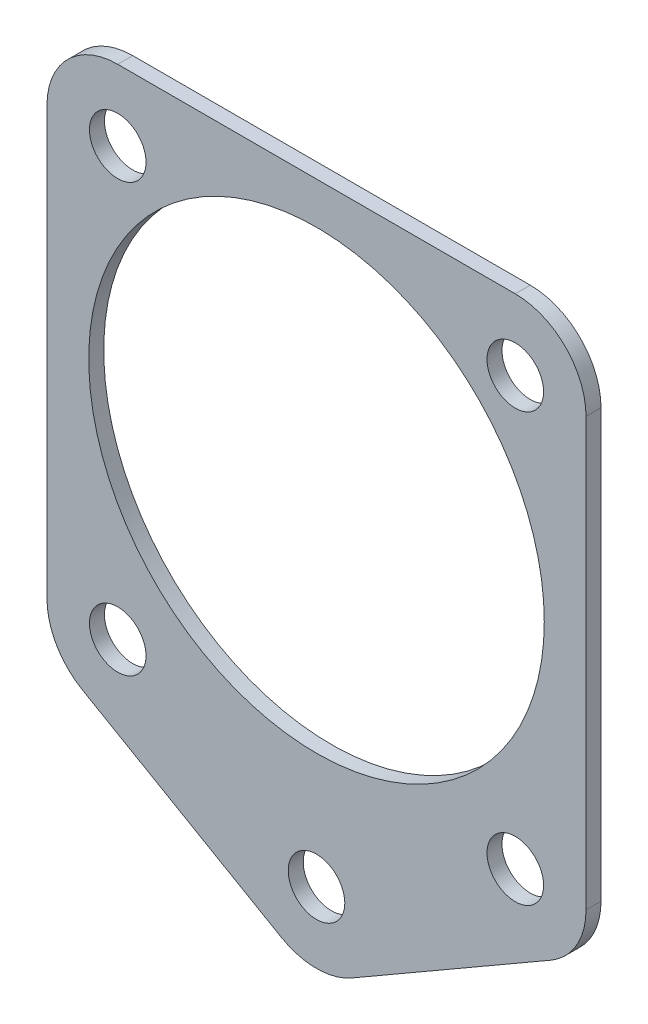
ISO-10303-21;
HEADER;
FILE_DESCRIPTION(('STEP AP214'),'2;1');
FILE_NAME('part.step','',(''),(''),'','','');
FILE_SCHEMA(('AUTOMOTIVE_DESIGN { 1 0 10303 214 1 1 1 1 }'));
ENDSEC;
DATA;
#1=APPLICATION_CONTEXT('core data for automotive mechanical design processes');
#2=APPLICATION_PROTOCOL_DEFINITION('international standard','automotive_design',2000,#1);
#3=PRODUCT_CONTEXT('',#1,'mechanical');
#4=PRODUCT('Part','Part','',(#3));
#5=PRODUCT_RELATED_PRODUCT_CATEGORY('part','',(#4));
#6=PRODUCT_DEFINITION_FORMATION('','',#4);
#7=PRODUCT_DEFINITION_CONTEXT('part definition',#1,'design');
#8=PRODUCT_DEFINITION('design','',#6,#7);
#9=PRODUCT_DEFINITION_SHAPE('','',#8);
#10=(LENGTH_UNIT() NAMED_UNIT(*) SI_UNIT(.MILLI.,.METRE.));
#11=(NAMED_UNIT(*) PLANE_ANGLE_UNIT() SI_UNIT($,.RADIAN.));
#12=(NAMED_UNIT(*) SI_UNIT($,.STERADIAN.) SOLID_ANGLE_UNIT());
#13=UNCERTAINTY_MEASURE_WITH_UNIT(LENGTH_MEASURE(1.E-05),#10,'distance_accuracy_value','');
#14=(GEOMETRIC_REPRESENTATION_CONTEXT(3) GLOBAL_UNCERTAINTY_ASSIGNED_CONTEXT((#13)) GLOBAL_UNIT_ASSIGNED_CONTEXT((#10,
#11,#12)) REPRESENTATION_CONTEXT('',''));
#15=CARTESIAN_POINT('',(0.,0.,0.));
#16=DIRECTION('',(0.,0.,1.));
#17=DIRECTION('',(1.,0.,0.));
#18=AXIS2_PLACEMENT_3D('',#15,#16,#17);
#19=CARTESIAN_POINT('',(6.35,3.66617420935412,1.3462));
#20=DIRECTION('',(0.,0.,1.));
#21=DIRECTION('',(1.,0.,0.));
#22=AXIS2_PLACEMENT_3D('',#19,#20,#21);
#23=PLANE('',#22);
#24=CARTESIAN_POINT('',(24.1935,-6.635775318931,1.3462));
#25=DIRECTION('',(0.,0.,1.));
#26=DIRECTION('',(1.,0.,0.));
#27=AXIS2_PLACEMENT_3D('',#24,#25,#26);
#28=CIRCLE('',#27,2.54);
#29=CARTESIAN_POINT('',(26.7335,-6.635775318931,1.3462));
#30=VERTEX_POINT('',#29);
#31=EDGE_CURVE('E229',#30,#30,#28,.T.);
#32=ORIENTED_EDGE('',*,*,#31,.F.);
#33=EDGE_LOOP('',(#32));
#34=FACE_BOUND('',#33,.T.);
#35=CARTESIAN_POINT('',(42.037,3.66617420935412,1.3462));
#36=DIRECTION('',(0.,0.,1.));
#37=DIRECTION('',(1.,0.,0.));
#38=AXIS2_PLACEMENT_3D('',#35,#36,#37);
#39=CIRCLE('',#38,2.54);
#40=CARTESIAN_POINT('',(44.577,3.66617420935412,1.3462));
#41=VERTEX_POINT('',#40);
#42=EDGE_CURVE('E217',#41,#41,#39,.T.);
#43=ORIENTED_EDGE('',*,*,#42,.F.);
#44=EDGE_LOOP('',(#43));
#45=FACE_BOUND('',#44,.T.);
#46=CARTESIAN_POINT('',(6.35,42.037,1.3462));
#47=DIRECTION('',(0.,0.,1.));
#48=DIRECTION('',(1.,0.,0.));
#49=AXIS2_PLACEMENT_3D('',#46,#47,#48);
#50=CIRCLE('',#49,2.54);
#51=CARTESIAN_POINT('',(8.89,42.037,1.3462));
#52=VERTEX_POINT('',#51);
#53=EDGE_CURVE('E145',#52,#52,#50,.T.);
#54=ORIENTED_EDGE('',*,*,#53,.F.);
#55=EDGE_LOOP('',(#54));
#56=FACE_BOUND('',#55,.T.);
#57=CARTESIAN_POINT('',(6.35,3.66617420935412,1.3462));
#58=DIRECTION('',(0.,0.,1.));
#59=DIRECTION('',(1.,0.,0.));
#60=AXIS2_PLACEMENT_3D('',#57,#58,#59);
#61=CIRCLE('',#60,6.35);
#62=CARTESIAN_POINT('',(0.,3.66617420935411,1.3462));
#63=VERTEX_POINT('',#62);
#64=CARTESIAN_POINT('',(3.175,-1.83308710467707,1.3462));
#65=VERTEX_POINT('',#64);
#66=EDGE_CURVE('E160',#63,#65,#61,.T.);
#67=ORIENTED_EDGE('',*,*,#66,.T.);
#68=DIRECTION('',(0.866025403784438,-0.500000000000001,0.));
#69=VECTOR('',#68,1.);
#70=CARTESIAN_POINT('',(3.175,-1.83308710467707,1.3462));
#71=LINE('',#70,#69);
#72=CARTESIAN_POINT('',(21.0185,-12.1350366329622,1.3462));
#73=VERTEX_POINT('',#72);
#74=EDGE_CURVE('E98',#65,#73,#71,.T.);
#75=ORIENTED_EDGE('',*,*,#74,.T.);
#76=CARTESIAN_POINT('',(24.1935,-6.635775318931,1.3462));
#77=DIRECTION('',(0.,0.,1.));
#78=DIRECTION('',(1.,0.,0.));
#79=AXIS2_PLACEMENT_3D('',#76,#77,#78);
#80=CIRCLE('',#79,6.35);
#81=CARTESIAN_POINT('',(27.3685,-12.1350366329622,1.3462));
#82=VERTEX_POINT('',#81);
#83=EDGE_CURVE('E181',#73,#82,#80,.T.);
#84=ORIENTED_EDGE('',*,*,#83,.T.);
#85=DIRECTION('',(0.866025403784438,0.500000000000001,0.));
#86=VECTOR('',#85,1.);
#87=CARTESIAN_POINT('',(27.3685,-12.1350366329622,1.3462));
#88=LINE('',#87,#86);
#89=CARTESIAN_POINT('',(45.212,-1.83308710467706,1.3462));
#90=VERTEX_POINT('',#89);
#91=EDGE_CURVE('E200',#82,#90,#88,.T.);
#92=ORIENTED_EDGE('',*,*,#91,.T.);
#93=CARTESIAN_POINT('',(42.037,3.66617420935412,1.3462));
#94=DIRECTION('',(0.,0.,1.));
#95=DIRECTION('',(1.,0.,0.));
#96=AXIS2_PLACEMENT_3D('',#93,#94,#95);
#97=CIRCLE('',#96,6.35);
#98=CARTESIAN_POINT('',(48.387,3.66617420935412,1.3462));
#99=VERTEX_POINT('',#98);
#100=EDGE_CURVE('E197',#90,#99,#97,.T.);
#101=ORIENTED_EDGE('',*,*,#100,.T.);
#102=DIRECTION('',(0.,1.,0.));
#103=VECTOR('',#102,1.);
#104=CARTESIAN_POINT('',(48.387,3.66617420935412,1.3462));
#105=LINE('',#104,#103);
#106=CARTESIAN_POINT('',(48.387,42.037,1.3462));
#107=VERTEX_POINT('',#106);
#108=EDGE_CURVE('E199',#99,#107,#105,.T.);
#109=ORIENTED_EDGE('',*,*,#108,.T.);
#110=CARTESIAN_POINT('',(42.037,42.037,1.3462));
#111=DIRECTION('',(0.,0.,1.));
#112=DIRECTION('',(1.,0.,0.));
#113=AXIS2_PLACEMENT_3D('',#110,#111,#112);
#114=CIRCLE('',#113,6.35);
#115=CARTESIAN_POINT('',(42.037,48.387,1.3462));
#116=VERTEX_POINT('',#115);
#117=EDGE_CURVE('E123',#107,#116,#114,.T.);
#118=ORIENTED_EDGE('',*,*,#117,.T.);
#119=DIRECTION('',(-1.,0.,0.));
#120=VECTOR('',#119,1.);
#121=CARTESIAN_POINT('',(42.037,48.387,1.3462));
#122=LINE('',#121,#120);
#123=CARTESIAN_POINT('',(6.35000000000004,48.387,1.3462));
#124=VERTEX_POINT('',#123);
#125=EDGE_CURVE('E117',#116,#124,#122,.T.);
#126=ORIENTED_EDGE('',*,*,#125,.T.);
#127=CARTESIAN_POINT('',(6.35,42.037,1.3462));
#128=DIRECTION('',(0.,0.,1.));
#129=DIRECTION('',(1.,0.,0.));
#130=AXIS2_PLACEMENT_3D('',#127,#128,#129);
#131=CIRCLE('',#130,6.35);
#132=CARTESIAN_POINT('',(0.,42.0369999999999,1.3462));
#133=VERTEX_POINT('',#132);
#134=EDGE_CURVE('E121',#124,#133,#131,.T.);
#135=ORIENTED_EDGE('',*,*,#134,.T.);
#136=DIRECTION('',(0.,-1.,0.));
#137=VECTOR('',#136,1.);
#138=CARTESIAN_POINT('',(0.,42.0369999999999,1.3462));
#139=LINE('',#138,#137);
#140=EDGE_CURVE('E49',#133,#63,#139,.T.);
#141=ORIENTED_EDGE('',*,*,#140,.T.);
#142=EDGE_LOOP('',(#67,#75,#84,#92,#101,#109,#118,#126,#135,#141));
#143=FACE_BOUND('',#142,.T.);
#144=CARTESIAN_POINT('',(42.037,42.037,1.3462));
#145=DIRECTION('',(0.,0.,1.));
#146=DIRECTION('',(1.,0.,0.));
#147=AXIS2_PLACEMENT_3D('',#144,#145,#146);
#148=CIRCLE('',#147,2.54);
#149=CARTESIAN_POINT('',(44.577,42.037,1.3462));
#150=VERTEX_POINT('',#149);
#151=EDGE_CURVE('E211',#150,#150,#148,.T.);
#152=ORIENTED_EDGE('',*,*,#151,.F.);
#153=EDGE_LOOP('',(#152));
#154=FACE_BOUND('',#153,.T.);
#155=CARTESIAN_POINT('',(6.35,3.66617420935412,1.3462));
#156=DIRECTION('',(0.,0.,1.));
#157=DIRECTION('',(1.,0.,0.));
#158=AXIS2_PLACEMENT_3D('',#155,#156,#157);
#159=CIRCLE('',#158,2.54);
#160=CARTESIAN_POINT('',(8.89,3.66617420935412,1.3462));
#161=VERTEX_POINT('',#160);
#162=EDGE_CURVE('E223',#161,#161,#159,.T.);
#163=ORIENTED_EDGE('',*,*,#162,.F.);
#164=EDGE_LOOP('',(#163));
#165=FACE_BOUND('',#164,.T.);
#166=CARTESIAN_POINT('',(24.1935,24.1935,1.3462));
#167=DIRECTION('',(0.,0.,1.));
#168=DIRECTION('',(1.,0.,0.));
#169=AXIS2_PLACEMENT_3D('',#166,#167,#168);
#170=CIRCLE('',#169,20.447);
#171=CARTESIAN_POINT('',(44.6405,24.1935,1.3462));
#172=VERTEX_POINT('',#171);
#173=EDGE_CURVE('E235',#172,#172,#170,.T.);
#174=ORIENTED_EDGE('',*,*,#173,.F.);
#175=EDGE_LOOP('',(#174));
#176=FACE_BOUND('',#175,.T.);
#177=ADVANCED_FACE('F32',(#34,#45,#56,#143,#154,#165,#176),#23,.T.);
#178=CARTESIAN_POINT('',(6.35,3.66617420935412,0.));
#179=DIRECTION('',(0.,0.,1.));
#180=DIRECTION('',(1.,0.,0.));
#181=AXIS2_PLACEMENT_3D('',#178,#179,#180);
#182=PLANE('',#181);
#183=CARTESIAN_POINT('',(24.1935,-6.635775318931,0.));
#184=DIRECTION('',(0.,0.,1.));
#185=DIRECTION('',(1.,0.,0.));
#186=AXIS2_PLACEMENT_3D('',#183,#184,#185);
#187=CIRCLE('',#186,2.54);
#188=CARTESIAN_POINT('',(26.7335,-6.635775318931,0.));
#189=VERTEX_POINT('',#188);
#190=EDGE_CURVE('E232',#189,#189,#187,.T.);
#191=ORIENTED_EDGE('',*,*,#190,.T.);
#192=EDGE_LOOP('',(#191));
#193=FACE_BOUND('',#192,.T.);
#194=CARTESIAN_POINT('',(42.037,3.66617420935412,0.));
#195=DIRECTION('',(0.,0.,1.));
#196=DIRECTION('',(1.,0.,0.));
#197=AXIS2_PLACEMENT_3D('',#194,#195,#196);
#198=CIRCLE('',#197,2.54);
#199=CARTESIAN_POINT('',(44.577,3.66617420935412,0.));
#200=VERTEX_POINT('',#199);
#201=EDGE_CURVE('E220',#200,#200,#198,.T.);
#202=ORIENTED_EDGE('',*,*,#201,.T.);
#203=EDGE_LOOP('',(#202));
#204=FACE_BOUND('',#203,.T.);
#205=CARTESIAN_POINT('',(6.35,42.037,0.));
#206=DIRECTION('',(0.,0.,1.));
#207=DIRECTION('',(1.,0.,0.));
#208=AXIS2_PLACEMENT_3D('',#205,#206,#207);
#209=CIRCLE('',#208,2.54);
#210=CARTESIAN_POINT('',(8.89,42.037,0.));
#211=VERTEX_POINT('',#210);
#212=EDGE_CURVE('E208',#211,#211,#209,.T.);
#213=ORIENTED_EDGE('',*,*,#212,.T.);
#214=EDGE_LOOP('',(#213));
#215=FACE_BOUND('',#214,.T.);
#216=CARTESIAN_POINT('',(6.35,3.66617420935412,0.));
#217=DIRECTION('',(0.,0.,1.));
#218=DIRECTION('',(1.,0.,0.));
#219=AXIS2_PLACEMENT_3D('',#216,#217,#218);
#220=CIRCLE('',#219,6.35);
#221=CARTESIAN_POINT('',(0.,3.66617420935411,0.));
#222=VERTEX_POINT('',#221);
#223=CARTESIAN_POINT('',(3.175,-1.83308710467707,0.));
#224=VERTEX_POINT('',#223);
#225=EDGE_CURVE('E141',#222,#224,#220,.T.);
#226=ORIENTED_EDGE('',*,*,#225,.F.);
#227=DIRECTION('',(0.,-1.,0.));
#228=VECTOR('',#227,1.);
#229=CARTESIAN_POINT('',(0.,42.0369999999999,0.));
#230=LINE('',#229,#228);
#231=CARTESIAN_POINT('',(0.,42.0369999999999,0.));
#232=VERTEX_POINT('',#231);
#233=EDGE_CURVE('E90',#232,#222,#230,.T.);
#234=ORIENTED_EDGE('',*,*,#233,.F.);
#235=CARTESIAN_POINT('',(6.35,42.037,0.));
#236=DIRECTION('',(0.,0.,1.));
#237=DIRECTION('',(1.,0.,0.));
#238=AXIS2_PLACEMENT_3D('',#235,#236,#237);
#239=CIRCLE('',#238,6.35);
#240=CARTESIAN_POINT('',(6.35000000000004,48.387,0.));
#241=VERTEX_POINT('',#240);
#242=EDGE_CURVE('E84',#241,#232,#239,.T.);
#243=ORIENTED_EDGE('',*,*,#242,.F.);
#244=DIRECTION('',(-1.,0.,0.));
#245=VECTOR('',#244,1.);
#246=CARTESIAN_POINT('',(42.037,48.387,0.));
#247=LINE('',#246,#245);
#248=CARTESIAN_POINT('',(42.037,48.387,0.));
#249=VERTEX_POINT('',#248);
#250=EDGE_CURVE('E131',#249,#241,#247,.T.);
#251=ORIENTED_EDGE('',*,*,#250,.F.);
#252=CARTESIAN_POINT('',(42.037,42.037,0.));
#253=DIRECTION('',(0.,0.,1.));
#254=DIRECTION('',(1.,0.,0.));
#255=AXIS2_PLACEMENT_3D('',#252,#253,#254);
#256=CIRCLE('',#255,6.35);
#257=CARTESIAN_POINT('',(48.387,42.037,0.));
#258=VERTEX_POINT('',#257);
#259=EDGE_CURVE('E155',#258,#249,#256,.T.);
#260=ORIENTED_EDGE('',*,*,#259,.F.);
#261=DIRECTION('',(0.,1.,0.));
#262=VECTOR('',#261,1.);
#263=CARTESIAN_POINT('',(48.387,3.66617420935412,0.));
#264=LINE('',#263,#262);
#265=CARTESIAN_POINT('',(48.387,3.66617420935412,0.));
#266=VERTEX_POINT('',#265);
#267=EDGE_CURVE('E153',#266,#258,#264,.T.);
#268=ORIENTED_EDGE('',*,*,#267,.F.);
#269=CARTESIAN_POINT('',(42.037,3.66617420935412,0.));
#270=DIRECTION('',(0.,0.,1.));
#271=DIRECTION('',(1.,0.,0.));
#272=AXIS2_PLACEMENT_3D('',#269,#270,#271);
#273=CIRCLE('',#272,6.35);
#274=CARTESIAN_POINT('',(45.212,-1.83308710467706,0.));
#275=VERTEX_POINT('',#274);
#276=EDGE_CURVE('E151',#275,#266,#273,.T.);
#277=ORIENTED_EDGE('',*,*,#276,.F.);
#278=DIRECTION('',(0.866025403784438,0.500000000000001,0.));
#279=VECTOR('',#278,1.);
#280=CARTESIAN_POINT('',(27.3685,-12.1350366329622,0.));
#281=LINE('',#280,#279);
#282=CARTESIAN_POINT('',(27.3685,-12.1350366329622,0.));
#283=VERTEX_POINT('',#282);
#284=EDGE_CURVE('E149',#283,#275,#281,.T.);
#285=ORIENTED_EDGE('',*,*,#284,.F.);
#286=CARTESIAN_POINT('',(24.1935,-6.635775318931,0.));
#287=DIRECTION('',(0.,0.,1.));
#288=DIRECTION('',(1.,0.,0.));
#289=AXIS2_PLACEMENT_3D('',#286,#287,#288);
#290=CIRCLE('',#289,6.35);
#291=CARTESIAN_POINT('',(21.0185,-12.1350366329622,0.));
#292=VERTEX_POINT('',#291);
#293=EDGE_CURVE('E147',#292,#283,#290,.T.);
#294=ORIENTED_EDGE('',*,*,#293,.F.);
#295=DIRECTION('',(0.866025403784438,-0.500000000000001,0.));
#296=VECTOR('',#295,1.);
#297=CARTESIAN_POINT('',(3.175,-1.83308710467707,0.));
#298=LINE('',#297,#296);
#299=EDGE_CURVE('E144',#224,#292,#298,.T.);
#300=ORIENTED_EDGE('',*,*,#299,.F.);
#301=EDGE_LOOP('',(#226,#234,#243,#251,#260,#268,#277,#285,#294,#300));
#302=FACE_BOUND('',#301,.T.);
#303=CARTESIAN_POINT('',(42.037,42.037,0.));
#304=DIRECTION('',(0.,0.,1.));
#305=DIRECTION('',(1.,0.,0.));
#306=AXIS2_PLACEMENT_3D('',#303,#304,#305);
#307=CIRCLE('',#306,2.54);
#308=CARTESIAN_POINT('',(44.577,42.037,0.));
#309=VERTEX_POINT('',#308);
#310=EDGE_CURVE('E214',#309,#309,#307,.T.);
#311=ORIENTED_EDGE('',*,*,#310,.T.);
#312=EDGE_LOOP('',(#311));
#313=FACE_BOUND('',#312,.T.);
#314=CARTESIAN_POINT('',(6.35,3.66617420935412,0.));
#315=DIRECTION('',(0.,0.,1.));
#316=DIRECTION('',(1.,0.,0.));
#317=AXIS2_PLACEMENT_3D('',#314,#315,#316);
#318=CIRCLE('',#317,2.54);
#319=CARTESIAN_POINT('',(8.89,3.66617420935412,0.));
#320=VERTEX_POINT('',#319);
#321=EDGE_CURVE('E226',#320,#320,#318,.T.);
#322=ORIENTED_EDGE('',*,*,#321,.T.);
#323=EDGE_LOOP('',(#322));
#324=FACE_BOUND('',#323,.T.);
#325=CARTESIAN_POINT('',(24.1935,24.1935,0.));
#326=DIRECTION('',(0.,0.,1.));
#327=DIRECTION('',(1.,0.,0.));
#328=AXIS2_PLACEMENT_3D('',#325,#326,#327);
#329=CIRCLE('',#328,20.447);
#330=CARTESIAN_POINT('',(44.6405,24.1935,0.));
#331=VERTEX_POINT('',#330);
#332=EDGE_CURVE('E238',#331,#331,#329,.T.);
#333=ORIENTED_EDGE('',*,*,#332,.T.);
#334=EDGE_LOOP('',(#333));
#335=FACE_BOUND('',#334,.T.);
#336=ADVANCED_FACE('F185',(#193,#204,#215,#302,#313,#324,#335),#182,.F.);
#337=CARTESIAN_POINT('',(6.35,3.66617420935412,1.3462));
#338=DIRECTION('',(0.,0.,-1.));
#339=DIRECTION('',(-1.,0.,0.));
#340=AXIS2_PLACEMENT_3D('',#337,#338,#339);
#341=CYLINDRICAL_SURFACE('',#340,6.35);
#342=ORIENTED_EDGE('',*,*,#225,.T.);
#343=DIRECTION('',(0.,0.,-1.));
#344=VECTOR('',#343,1.);
#345=CARTESIAN_POINT('',(3.175,-1.83308710467707,1.3462));
#346=LINE('',#345,#344);
#347=EDGE_CURVE('E11',#65,#224,#346,.T.);
#348=ORIENTED_EDGE('',*,*,#347,.F.);
#349=ORIENTED_EDGE('',*,*,#66,.F.);
#350=DIRECTION('',(0.,0.,-1.));
#351=VECTOR('',#350,1.);
#352=CARTESIAN_POINT('',(0.,3.66617420935411,1.3462));
#353=LINE('',#352,#351);
#354=EDGE_CURVE('E137',#63,#222,#353,.T.);
#355=ORIENTED_EDGE('',*,*,#354,.T.);
#356=EDGE_LOOP('',(#342,#348,#349,#355));
#357=FACE_BOUND('',#356,.T.);
#358=ADVANCED_FACE('F34',(#357),#341,.T.);
#359=CARTESIAN_POINT('',(3.175,-1.83308710467707,1.3462));
#360=DIRECTION('',(0.500000000000001,0.866025403784438,0.));
#361=DIRECTION('',(-0.866025403784438,0.500000000000001,0.));
#362=AXIS2_PLACEMENT_3D('',#359,#360,#361);
#363=PLANE('',#362);
#364=ORIENTED_EDGE('',*,*,#299,.T.);
#365=DIRECTION('',(0.,0.,-1.));
#366=VECTOR('',#365,1.);
#367=CARTESIAN_POINT('',(21.0185,-12.1350366329622,1.3462));
#368=LINE('',#367,#366);
#369=EDGE_CURVE('E41',#73,#292,#368,.T.);
#370=ORIENTED_EDGE('',*,*,#369,.F.);
#371=ORIENTED_EDGE('',*,*,#74,.F.);
#372=ORIENTED_EDGE('',*,*,#347,.T.);
#373=EDGE_LOOP('',(#364,#370,#371,#372));
#374=FACE_BOUND('',#373,.T.);
#375=ADVANCED_FACE('F281',(#374),#363,.F.);
#376=CARTESIAN_POINT('',(24.1935,-6.635775318931,1.3462));
#377=DIRECTION('',(0.,0.,-1.));
#378=DIRECTION('',(-1.,0.,0.));
#379=AXIS2_PLACEMENT_3D('',#376,#377,#378);
#380=CYLINDRICAL_SURFACE('',#379,6.35);
#381=ORIENTED_EDGE('',*,*,#293,.T.);
#382=DIRECTION('',(0.,0.,-1.));
#383=VECTOR('',#382,1.);
#384=CARTESIAN_POINT('',(27.3685,-12.1350366329622,1.3462));
#385=LINE('',#384,#383);
#386=EDGE_CURVE('E173',#82,#283,#385,.T.);
#387=ORIENTED_EDGE('',*,*,#386,.F.);
#388=ORIENTED_EDGE('',*,*,#83,.F.);
#389=ORIENTED_EDGE('',*,*,#369,.T.);
#390=EDGE_LOOP('',(#381,#387,#388,#389));
#391=FACE_BOUND('',#390,.T.);
#392=ADVANCED_FACE('F179',(#391),#380,.T.);
#393=CARTESIAN_POINT('',(27.3685,-12.1350366329622,1.3462));
#394=DIRECTION('',(-0.500000000000001,0.866025403784438,0.));
#395=DIRECTION('',(-0.866025403784438,-0.500000000000001,0.));
#396=AXIS2_PLACEMENT_3D('',#393,#394,#395);
#397=PLANE('',#396);
#398=ORIENTED_EDGE('',*,*,#284,.T.);
#399=DIRECTION('',(0.,0.,-1.));
#400=VECTOR('',#399,1.);
#401=CARTESIAN_POINT('',(45.212,-1.83308710467706,1.3462));
#402=LINE('',#401,#400);
#403=EDGE_CURVE('E170',#90,#275,#402,.T.);
#404=ORIENTED_EDGE('',*,*,#403,.F.);
#405=ORIENTED_EDGE('',*,*,#91,.F.);
#406=ORIENTED_EDGE('',*,*,#386,.T.);
#407=EDGE_LOOP('',(#398,#404,#405,#406));
#408=FACE_BOUND('',#407,.T.);
#409=ADVANCED_FACE('F191',(#408),#397,.F.);
#410=CARTESIAN_POINT('',(42.037,3.66617420935412,1.3462));
#411=DIRECTION('',(0.,0.,-1.));
#412=DIRECTION('',(-1.,0.,0.));
#413=AXIS2_PLACEMENT_3D('',#410,#411,#412);
#414=CYLINDRICAL_SURFACE('',#413,6.35);
#415=ORIENTED_EDGE('',*,*,#276,.T.);
#416=DIRECTION('',(0.,0.,-1.));
#417=VECTOR('',#416,1.);
#418=CARTESIAN_POINT('',(48.387,3.66617420935412,1.3462));
#419=LINE('',#418,#417);
#420=EDGE_CURVE('E167',#99,#266,#419,.T.);
#421=ORIENTED_EDGE('',*,*,#420,.F.);
#422=ORIENTED_EDGE('',*,*,#100,.F.);
#423=ORIENTED_EDGE('',*,*,#403,.T.);
#424=EDGE_LOOP('',(#415,#421,#422,#423));
#425=FACE_BOUND('',#424,.T.);
#426=ADVANCED_FACE('F195',(#425),#414,.T.);
#427=CARTESIAN_POINT('',(48.387,3.66617420935412,1.3462));
#428=DIRECTION('',(-1.,0.,0.));
#429=DIRECTION('',(0.,0.,1.));
#430=AXIS2_PLACEMENT_3D('',#427,#428,#429);
#431=PLANE('',#430);
#432=ORIENTED_EDGE('',*,*,#267,.T.);
#433=DIRECTION('',(0.,0.,-1.));
#434=VECTOR('',#433,1.);
#435=CARTESIAN_POINT('',(48.387,42.037,1.3462));
#436=LINE('',#435,#434);
#437=EDGE_CURVE('E164',#107,#258,#436,.T.);
#438=ORIENTED_EDGE('',*,*,#437,.F.);
#439=ORIENTED_EDGE('',*,*,#108,.F.);
#440=ORIENTED_EDGE('',*,*,#420,.T.);
#441=EDGE_LOOP('',(#432,#438,#439,#440));
#442=FACE_BOUND('',#441,.T.);
#443=ADVANCED_FACE('F271',(#442),#431,.F.);
#444=CARTESIAN_POINT('',(42.037,42.037,1.3462));
#445=DIRECTION('',(0.,0.,-1.));
#446=DIRECTION('',(-1.,0.,0.));
#447=AXIS2_PLACEMENT_3D('',#444,#445,#446);
#448=CYLINDRICAL_SURFACE('',#447,6.35);
#449=ORIENTED_EDGE('',*,*,#259,.T.);
#450=DIRECTION('',(0.,0.,-1.));
#451=VECTOR('',#450,1.);
#452=CARTESIAN_POINT('',(42.037,48.387,1.3462));
#453=LINE('',#452,#451);
#454=EDGE_CURVE('E132',#116,#249,#453,.T.);
#455=ORIENTED_EDGE('',*,*,#454,.F.);
#456=ORIENTED_EDGE('',*,*,#117,.F.);
#457=ORIENTED_EDGE('',*,*,#437,.T.);
#458=EDGE_LOOP('',(#449,#455,#456,#457));
#459=FACE_BOUND('',#458,.T.);
#460=ADVANCED_FACE('F268',(#459),#448,.T.);
#461=CARTESIAN_POINT('',(42.037,48.387,1.3462));
#462=DIRECTION('',(0.,-1.,0.));
#463=DIRECTION('',(1.,0.,0.));
#464=AXIS2_PLACEMENT_3D('',#461,#462,#463);
#465=PLANE('',#464);
#466=ORIENTED_EDGE('',*,*,#250,.T.);
#467=DIRECTION('',(0.,0.,-1.));
#468=VECTOR('',#467,1.);
#469=CARTESIAN_POINT('',(6.35000000000004,48.387,1.3462));
#470=LINE('',#469,#468);
#471=EDGE_CURVE('E128',#124,#241,#470,.T.);
#472=ORIENTED_EDGE('',*,*,#471,.F.);
#473=ORIENTED_EDGE('',*,*,#125,.F.);
#474=ORIENTED_EDGE('',*,*,#454,.T.);
#475=EDGE_LOOP('',(#466,#472,#473,#474));
#476=FACE_BOUND('',#475,.T.);
#477=ADVANCED_FACE('F129',(#476),#465,.F.);
#478=CARTESIAN_POINT('',(6.35,42.037,1.3462));
#479=DIRECTION('',(0.,0.,-1.));
#480=DIRECTION('',(-1.,0.,0.));
#481=AXIS2_PLACEMENT_3D('',#478,#479,#480);
#482=CYLINDRICAL_SURFACE('',#481,6.35);
#483=ORIENTED_EDGE('',*,*,#242,.T.);
#484=DIRECTION('',(0.,0.,-1.));
#485=VECTOR('',#484,1.);
#486=CARTESIAN_POINT('',(0.,42.0369999999999,1.3462));
#487=LINE('',#486,#485);
#488=EDGE_CURVE('E133',#133,#232,#487,.T.);
#489=ORIENTED_EDGE('',*,*,#488,.F.);
#490=ORIENTED_EDGE('',*,*,#134,.F.);
#491=ORIENTED_EDGE('',*,*,#471,.T.);
#492=EDGE_LOOP('',(#483,#489,#490,#491));
#493=FACE_BOUND('',#492,.T.);
#494=ADVANCED_FACE('F135',(#493),#482,.T.);
#495=CARTESIAN_POINT('',(0.,42.0369999999999,1.3462));
#496=DIRECTION('',(1.,0.,0.));
#497=DIRECTION('',(0.,1.,0.));
#498=AXIS2_PLACEMENT_3D('',#495,#496,#497);
#499=PLANE('',#498);
#500=ORIENTED_EDGE('',*,*,#233,.T.);
#501=ORIENTED_EDGE('',*,*,#354,.F.);
#502=ORIENTED_EDGE('',*,*,#140,.F.);
#503=ORIENTED_EDGE('',*,*,#488,.T.);
#504=EDGE_LOOP('',(#500,#501,#502,#503));
#505=FACE_BOUND('',#504,.T.);
#506=ADVANCED_FACE('F261',(#505),#499,.F.);
#507=CARTESIAN_POINT('',(6.35,42.037,1.3462));
#508=DIRECTION('',(0.,0.,-1.));
#509=DIRECTION('',(-1.,0.,0.));
#510=AXIS2_PLACEMENT_3D('',#507,#508,#509);
#511=CYLINDRICAL_SURFACE('',#510,2.54);
#512=ORIENTED_EDGE('',*,*,#53,.T.);
#513=EDGE_LOOP('',(#512));
#514=FACE_BOUND('',#513,.T.);
#515=ORIENTED_EDGE('',*,*,#212,.F.);
#516=EDGE_LOOP('',(#515));
#517=FACE_BOUND('',#516,.T.);
#518=ADVANCED_FACE('F258',(#514,#517),#511,.F.);
#519=CARTESIAN_POINT('',(42.037,42.037,1.3462));
#520=DIRECTION('',(0.,0.,-1.));
#521=DIRECTION('',(-1.,0.,0.));
#522=AXIS2_PLACEMENT_3D('',#519,#520,#521);
#523=CYLINDRICAL_SURFACE('',#522,2.54);
#524=ORIENTED_EDGE('',*,*,#151,.T.);
#525=EDGE_LOOP('',(#524));
#526=FACE_BOUND('',#525,.T.);
#527=ORIENTED_EDGE('',*,*,#310,.F.);
#528=EDGE_LOOP('',(#527));
#529=FACE_BOUND('',#528,.T.);
#530=ADVANCED_FACE('F357',(#526,#529),#523,.F.);
#531=CARTESIAN_POINT('',(42.037,3.66617420935412,1.3462));
#532=DIRECTION('',(0.,0.,-1.));
#533=DIRECTION('',(-1.,0.,0.));
#534=AXIS2_PLACEMENT_3D('',#531,#532,#533);
#535=CYLINDRICAL_SURFACE('',#534,2.54);
#536=ORIENTED_EDGE('',*,*,#42,.T.);
#537=EDGE_LOOP('',(#536));
#538=FACE_BOUND('',#537,.T.);
#539=ORIENTED_EDGE('',*,*,#201,.F.);
#540=EDGE_LOOP('',(#539));
#541=FACE_BOUND('',#540,.T.);
#542=ADVANCED_FACE('F365',(#538,#541),#535,.F.);
#543=CARTESIAN_POINT('',(6.35,3.66617420935412,1.3462));
#544=DIRECTION('',(0.,0.,-1.));
#545=DIRECTION('',(-1.,0.,0.));
#546=AXIS2_PLACEMENT_3D('',#543,#544,#545);
#547=CYLINDRICAL_SURFACE('',#546,2.54);
#548=ORIENTED_EDGE('',*,*,#162,.T.);
#549=EDGE_LOOP('',(#548));
#550=FACE_BOUND('',#549,.T.);
#551=ORIENTED_EDGE('',*,*,#321,.F.);
#552=EDGE_LOOP('',(#551));
#553=FACE_BOUND('',#552,.T.);
#554=ADVANCED_FACE('F373',(#550,#553),#547,.F.);
#555=CARTESIAN_POINT('',(24.1935,-6.635775318931,1.3462));
#556=DIRECTION('',(0.,0.,-1.));
#557=DIRECTION('',(-1.,0.,0.));
#558=AXIS2_PLACEMENT_3D('',#555,#556,#557);
#559=CYLINDRICAL_SURFACE('',#558,2.54);
#560=ORIENTED_EDGE('',*,*,#31,.T.);
#561=EDGE_LOOP('',(#560));
#562=FACE_BOUND('',#561,.T.);
#563=ORIENTED_EDGE('',*,*,#190,.F.);
#564=EDGE_LOOP('',(#563));
#565=FACE_BOUND('',#564,.T.);
#566=ADVANCED_FACE('F382',(#562,#565),#559,.F.);
#567=CARTESIAN_POINT('',(24.1935,24.1935,1.3462));
#568=DIRECTION('',(0.,0.,-1.));
#569=DIRECTION('',(-1.,0.,0.));
#570=AXIS2_PLACEMENT_3D('',#567,#568,#569);
#571=CYLINDRICAL_SURFACE('',#570,20.447);
#572=ORIENTED_EDGE('',*,*,#173,.T.);
#573=EDGE_LOOP('',(#572));
#574=FACE_BOUND('',#573,.T.);
#575=ORIENTED_EDGE('',*,*,#332,.F.);
#576=EDGE_LOOP('',(#575));
#577=FACE_BOUND('',#576,.T.);
#578=ADVANCED_FACE('F244',(#574,#577),#571,.F.);
#579=CLOSED_SHELL('',(#177,#336,#358,#375,#392,#409,#426,#443,#460,#477,#494,#506,#518,#530,
#542,#554,#566,#578));
#580=MANIFOLD_SOLID_BREP('B2',#579);
#581=ADVANCED_BREP_SHAPE_REPRESENTATION('',(#18,#580),#14);
#582=SHAPE_DEFINITION_REPRESENTATION(#9,#581);
ENDSEC;
END-ISO-10303-21;
